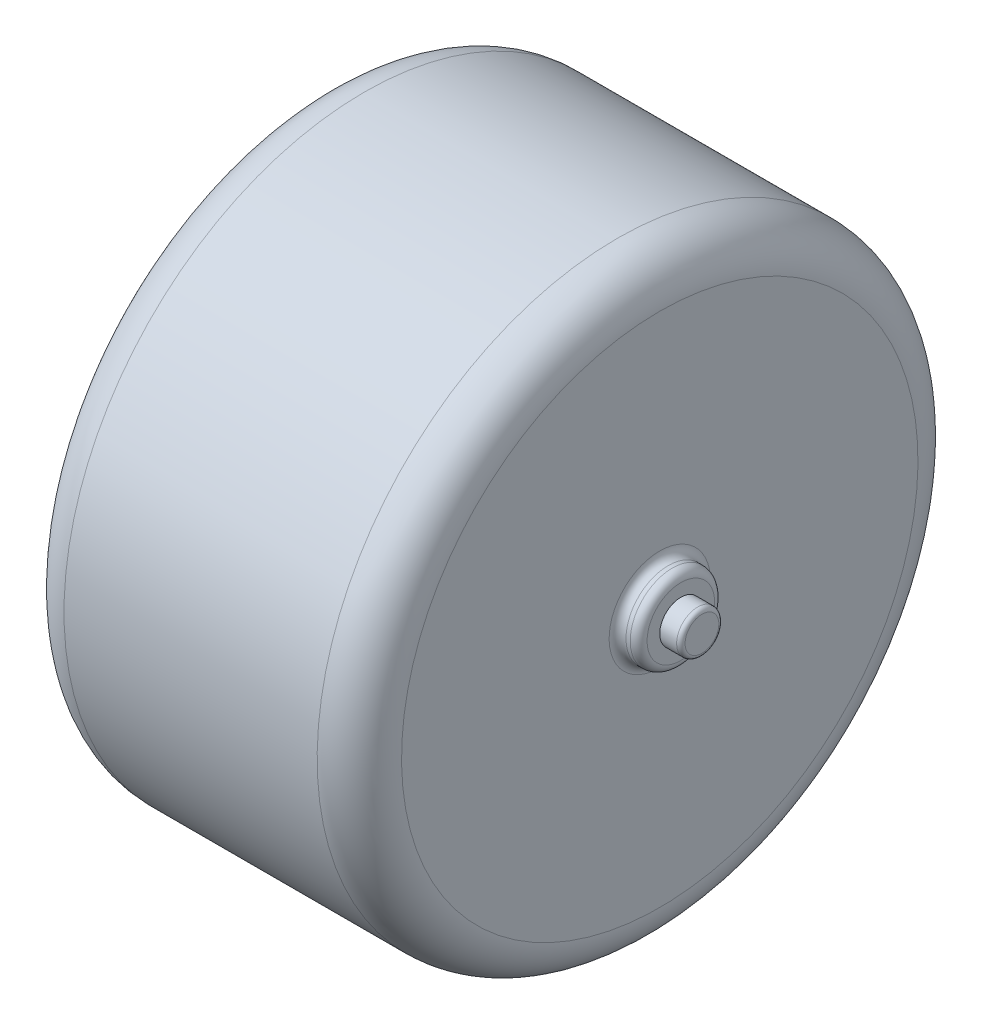
ISO-10303-21;
HEADER;
FILE_DESCRIPTION(('STEP AP214'),'2;1');
FILE_NAME('part.step','',(''),(''),'','','');
FILE_SCHEMA(('AUTOMOTIVE_DESIGN { 1 0 10303 214 1 1 1 1 }'));
ENDSEC;
DATA;
#1=APPLICATION_CONTEXT('core data for automotive mechanical design processes');
#2=APPLICATION_PROTOCOL_DEFINITION('international standard','automotive_design',2000,#1);
#3=PRODUCT_CONTEXT('',#1,'mechanical');
#4=PRODUCT('Part','Part','',(#3));
#5=PRODUCT_RELATED_PRODUCT_CATEGORY('part','',(#4));
#6=PRODUCT_DEFINITION_FORMATION('','',#4);
#7=PRODUCT_DEFINITION_CONTEXT('part definition',#1,'design');
#8=PRODUCT_DEFINITION('design','',#6,#7);
#9=PRODUCT_DEFINITION_SHAPE('','',#8);
#10=(LENGTH_UNIT() NAMED_UNIT(*) SI_UNIT(.MILLI.,.METRE.));
#11=(NAMED_UNIT(*) PLANE_ANGLE_UNIT() SI_UNIT($,.RADIAN.));
#12=(NAMED_UNIT(*) SI_UNIT($,.STERADIAN.) SOLID_ANGLE_UNIT());
#13=UNCERTAINTY_MEASURE_WITH_UNIT(LENGTH_MEASURE(1.E-05),#10,'distance_accuracy_value','');
#14=(GEOMETRIC_REPRESENTATION_CONTEXT(3) GLOBAL_UNCERTAINTY_ASSIGNED_CONTEXT((#13)) GLOBAL_UNIT_ASSIGNED_CONTEXT((#10,
#11,#12)) REPRESENTATION_CONTEXT('',''));
#15=CARTESIAN_POINT('',(0.,0.,0.));
#16=DIRECTION('',(0.,0.,1.));
#17=DIRECTION('',(1.,0.,0.));
#18=AXIS2_PLACEMENT_3D('',#15,#16,#17);
#19=CARTESIAN_POINT('',(0.,0.,0.));
#20=DIRECTION('',(-1.,0.,0.));
#21=DIRECTION('',(0.,-1.,0.));
#22=AXIS2_PLACEMENT_3D('',#19,#20,#21);
#23=PLANE('',#22);
#24=CARTESIAN_POINT('',(0.,0.,0.));
#25=DIRECTION('',(-1.,0.,0.));
#26=DIRECTION('',(0.,-1.,0.));
#27=AXIS2_PLACEMENT_3D('',#24,#25,#26);
#28=CIRCLE('',#27,5.08);
#29=CARTESIAN_POINT('',(0.,-5.08,0.));
#30=VERTEX_POINT('',#29);
#31=EDGE_CURVE('E11',#30,#30,#28,.T.);
#32=ORIENTED_EDGE('',*,*,#31,.T.);
#33=EDGE_LOOP('',(#32));
#34=FACE_BOUND('',#33,.T.);
#35=ADVANCED_FACE('F38',(#34),#23,.T.);
#36=CARTESIAN_POINT('',(146.05,0.,0.));
#37=DIRECTION('',(1.,0.,0.));
#38=DIRECTION('',(0.,1.,0.));
#39=AXIS2_PLACEMENT_3D('',#36,#37,#38);
#40=CYLINDRICAL_SURFACE('',#39,6.35);
#41=CARTESIAN_POINT('',(1.26999999999999,0.,0.));
#42=DIRECTION('',(-1.,0.,0.));
#43=DIRECTION('',(0.,-1.,0.));
#44=AXIS2_PLACEMENT_3D('',#41,#42,#43);
#45=CIRCLE('',#44,6.35);
#46=CARTESIAN_POINT('',(1.26999999999999,-6.35,0.));
#47=VERTEX_POINT('',#46);
#48=EDGE_CURVE('E46',#47,#47,#45,.F.);
#49=ORIENTED_EDGE('',*,*,#48,.T.);
#50=EDGE_LOOP('',(#49));
#51=FACE_BOUND('',#50,.T.);
#52=CARTESIAN_POINT('',(25.4,0.,0.));
#53=DIRECTION('',(1.,0.,0.));
#54=DIRECTION('',(0.,1.,0.));
#55=AXIS2_PLACEMENT_3D('',#52,#53,#54);
#56=CIRCLE('',#55,6.35);
#57=CARTESIAN_POINT('',(25.4,6.35,0.));
#58=VERTEX_POINT('',#57);
#59=EDGE_CURVE('E100',#58,#58,#56,.T.);
#60=ORIENTED_EDGE('',*,*,#59,.F.);
#61=EDGE_LOOP('',(#60));
#62=FACE_BOUND('',#61,.T.);
#63=ADVANCED_FACE('F147',(#51,#62),#40,.T.);
#64=CARTESIAN_POINT('',(25.4,6.35,0.));
#65=DIRECTION('',(-1.,0.,0.));
#66=DIRECTION('',(0.,-1.,0.));
#67=AXIS2_PLACEMENT_3D('',#64,#65,#66);
#68=PLANE('',#67);
#69=CARTESIAN_POINT('',(25.4,0.,0.));
#70=DIRECTION('',(-1.,0.,0.));
#71=DIRECTION('',(0.,-1.,0.));
#72=AXIS2_PLACEMENT_3D('',#69,#70,#71);
#73=CIRCLE('',#72,10.16);
#74=CARTESIAN_POINT('',(25.4,-10.16,0.));
#75=VERTEX_POINT('',#74);
#76=EDGE_CURVE('E121',#75,#75,#73,.T.);
#77=ORIENTED_EDGE('',*,*,#76,.T.);
#78=EDGE_LOOP('',(#77));
#79=FACE_BOUND('',#78,.T.);
#80=ORIENTED_EDGE('',*,*,#59,.T.);
#81=EDGE_LOOP('',(#80));
#82=FACE_BOUND('',#81,.T.);
#83=ADVANCED_FACE('F169',(#79,#82),#68,.T.);
#84=CARTESIAN_POINT('',(146.05,0.,0.));
#85=DIRECTION('',(1.,0.,0.));
#86=DIRECTION('',(0.,1.,0.));
#87=AXIS2_PLACEMENT_3D('',#84,#85,#86);
#88=CYLINDRICAL_SURFACE('',#87,12.7);
#89=CARTESIAN_POINT('',(27.94,0.,0.));
#90=DIRECTION('',(-1.,0.,0.));
#91=DIRECTION('',(0.,-1.,0.));
#92=AXIS2_PLACEMENT_3D('',#89,#90,#91);
#93=CIRCLE('',#92,12.7);
#94=CARTESIAN_POINT('',(27.94,-12.7,0.));
#95=VERTEX_POINT('',#94);
#96=EDGE_CURVE('E118',#95,#95,#93,.F.);
#97=ORIENTED_EDGE('',*,*,#96,.T.);
#98=EDGE_LOOP('',(#97));
#99=FACE_BOUND('',#98,.T.);
#100=CARTESIAN_POINT('',(29.21,0.,0.));
#101=DIRECTION('',(-1.,0.,0.));
#102=DIRECTION('',(0.,-1.,0.));
#103=AXIS2_PLACEMENT_3D('',#100,#101,#102);
#104=CIRCLE('',#103,12.7);
#105=CARTESIAN_POINT('',(29.21,-12.7,0.));
#106=VERTEX_POINT('',#105);
#107=EDGE_CURVE('E115',#106,#106,#104,.T.);
#108=ORIENTED_EDGE('',*,*,#107,.T.);
#109=EDGE_LOOP('',(#108));
#110=FACE_BOUND('',#109,.T.);
#111=ADVANCED_FACE('F233',(#99,#110),#88,.T.);
#112=CARTESIAN_POINT('',(31.75,12.7,0.));
#113=DIRECTION('',(-1.,0.,0.));
#114=DIRECTION('',(0.,-1.,0.));
#115=AXIS2_PLACEMENT_3D('',#112,#113,#114);
#116=PLANE('',#115);
#117=CARTESIAN_POINT('',(31.75,-31.7499999999995,-54.9926131403121));
#118=DIRECTION('',(-1.,0.,0.));
#119=DIRECTION('',(0.,0.,1.));
#120=AXIS2_PLACEMENT_3D('',#117,#118,#119);
#121=CIRCLE('',#120,4.7625);
#122=CARTESIAN_POINT('',(31.75,-31.7499999999995,-50.2301131403121));
#123=VERTEX_POINT('',#122);
#124=EDGE_CURVE('E449',#123,#123,#121,.T.);
#125=ORIENTED_EDGE('',*,*,#124,.F.);
#126=EDGE_LOOP('',(#125));
#127=FACE_BOUND('',#126,.T.);
#128=CARTESIAN_POINT('',(31.75,-31.7500000000003,54.9926131403117));
#129=DIRECTION('',(-1.,0.,0.));
#130=DIRECTION('',(0.,0.,1.));
#131=AXIS2_PLACEMENT_3D('',#128,#129,#130);
#132=CIRCLE('',#131,4.7625);
#133=CARTESIAN_POINT('',(31.75,-31.7500000000003,59.7551131403117));
#134=VERTEX_POINT('',#133);
#135=EDGE_CURVE('E66',#134,#134,#132,.T.);
#136=ORIENTED_EDGE('',*,*,#135,.F.);
#137=EDGE_LOOP('',(#136));
#138=FACE_BOUND('',#137,.T.);
#139=CARTESIAN_POINT('',(31.75,63.5,0.));
#140=DIRECTION('',(-1.,0.,0.));
#141=DIRECTION('',(0.,0.,1.));
#142=AXIS2_PLACEMENT_3D('',#139,#140,#141);
#143=CIRCLE('',#142,4.7625);
#144=CARTESIAN_POINT('',(31.75,63.5,4.7625));
#145=VERTEX_POINT('',#144);
#146=EDGE_CURVE('E85',#145,#145,#143,.T.);
#147=ORIENTED_EDGE('',*,*,#146,.F.);
#148=EDGE_LOOP('',(#147));
#149=FACE_BOUND('',#148,.T.);
#150=CARTESIAN_POINT('',(31.75,0.,0.));
#151=DIRECTION('',(-1.,0.,0.));
#152=DIRECTION('',(0.,-1.,0.));
#153=AXIS2_PLACEMENT_3D('',#150,#151,#152);
#154=CIRCLE('',#153,15.24);
#155=CARTESIAN_POINT('',(31.75,-15.24,0.));
#156=VERTEX_POINT('',#155);
#157=EDGE_CURVE('E124',#156,#156,#154,.F.);
#158=ORIENTED_EDGE('',*,*,#157,.T.);
#159=EDGE_LOOP('',(#158));
#160=FACE_BOUND('',#159,.T.);
#161=CARTESIAN_POINT('',(31.75,0.,0.));
#162=DIRECTION('',(-1.,0.,0.));
#163=DIRECTION('',(0.,-1.,0.));
#164=AXIS2_PLACEMENT_3D('',#161,#162,#163);
#165=CIRCLE('',#164,77.7300961765321);
#166=CARTESIAN_POINT('',(31.75,-77.7300961765321,0.));
#167=VERTEX_POINT('',#166);
#168=EDGE_CURVE('E112',#167,#167,#165,.T.);
#169=ORIENTED_EDGE('',*,*,#168,.T.);
#170=EDGE_LOOP('',(#169));
#171=FACE_BOUND('',#170,.T.);
#172=ADVANCED_FACE('F229',(#127,#138,#149,#160,#171),#116,.T.);
#173=CARTESIAN_POINT('',(146.05,0.,0.));
#174=DIRECTION('',(1.,0.,0.));
#175=DIRECTION('',(0.,1.,0.));
#176=AXIS2_PLACEMENT_3D('',#173,#174,#175);
#177=CYLINDRICAL_SURFACE('',#176,90.4300961765321);
#178=CARTESIAN_POINT('',(120.65,0.,0.));
#179=DIRECTION('',(1.,0.,0.));
#180=DIRECTION('',(0.,1.,0.));
#181=AXIS2_PLACEMENT_3D('',#178,#179,#180);
#182=CIRCLE('',#181,90.4300961765321);
#183=CARTESIAN_POINT('',(120.65,90.4300961765321,0.));
#184=VERTEX_POINT('',#183);
#185=EDGE_CURVE('E109',#184,#184,#182,.F.);
#186=ORIENTED_EDGE('',*,*,#185,.T.);
#187=EDGE_LOOP('',(#186));
#188=FACE_BOUND('',#187,.T.);
#189=CARTESIAN_POINT('',(44.45,0.,0.));
#190=DIRECTION('',(-1.,0.,0.));
#191=DIRECTION('',(0.,-1.,0.));
#192=AXIS2_PLACEMENT_3D('',#189,#190,#191);
#193=CIRCLE('',#192,90.4300961765321);
#194=CARTESIAN_POINT('',(44.45,-90.4300961765321,0.));
#195=VERTEX_POINT('',#194);
#196=EDGE_CURVE('E106',#195,#195,#193,.F.);
#197=ORIENTED_EDGE('',*,*,#196,.T.);
#198=EDGE_LOOP('',(#197));
#199=FACE_BOUND('',#198,.T.);
#200=ADVANCED_FACE('F225',(#188,#199),#177,.T.);
#201=CARTESIAN_POINT('',(133.35,90.4300961765321,0.));
#202=DIRECTION('',(1.,0.,0.));
#203=DIRECTION('',(0.,1.,0.));
#204=AXIS2_PLACEMENT_3D('',#201,#202,#203);
#205=PLANE('',#204);
#206=CARTESIAN_POINT('',(133.35,0.,0.));
#207=DIRECTION('',(1.,0.,0.));
#208=DIRECTION('',(0.,1.,0.));
#209=AXIS2_PLACEMENT_3D('',#206,#207,#208);
#210=CIRCLE('',#209,15.24);
#211=CARTESIAN_POINT('',(133.35,15.24,0.));
#212=VERTEX_POINT('',#211);
#213=EDGE_CURVE('E133',#212,#212,#210,.F.);
#214=ORIENTED_EDGE('',*,*,#213,.T.);
#215=EDGE_LOOP('',(#214));
#216=FACE_BOUND('',#215,.T.);
#217=CARTESIAN_POINT('',(133.35,0.,0.));
#218=DIRECTION('',(1.,0.,0.));
#219=DIRECTION('',(0.,1.,0.));
#220=AXIS2_PLACEMENT_3D('',#217,#218,#219);
#221=CIRCLE('',#220,77.7300961765321);
#222=CARTESIAN_POINT('',(133.35,77.7300961765321,0.));
#223=VERTEX_POINT('',#222);
#224=EDGE_CURVE('E103',#223,#223,#221,.T.);
#225=ORIENTED_EDGE('',*,*,#224,.T.);
#226=EDGE_LOOP('',(#225));
#227=FACE_BOUND('',#226,.T.);
#228=ADVANCED_FACE('F221',(#216,#227),#205,.T.);
#229=CARTESIAN_POINT('',(146.05,0.,0.));
#230=DIRECTION('',(1.,0.,0.));
#231=DIRECTION('',(0.,1.,0.));
#232=AXIS2_PLACEMENT_3D('',#229,#230,#231);
#233=CYLINDRICAL_SURFACE('',#232,12.7);
#234=CARTESIAN_POINT('',(135.89,0.,0.));
#235=DIRECTION('',(1.,0.,0.));
#236=DIRECTION('',(0.,1.,0.));
#237=AXIS2_PLACEMENT_3D('',#234,#235,#236);
#238=CIRCLE('',#237,12.7);
#239=CARTESIAN_POINT('',(135.89,12.7,0.));
#240=VERTEX_POINT('',#239);
#241=EDGE_CURVE('E130',#240,#240,#238,.T.);
#242=ORIENTED_EDGE('',*,*,#241,.T.);
#243=EDGE_LOOP('',(#242));
#244=FACE_BOUND('',#243,.T.);
#245=CARTESIAN_POINT('',(137.16,0.,0.));
#246=DIRECTION('',(1.,0.,0.));
#247=DIRECTION('',(0.,1.,0.));
#248=AXIS2_PLACEMENT_3D('',#245,#246,#247);
#249=CIRCLE('',#248,12.7);
#250=CARTESIAN_POINT('',(137.16,12.7,0.));
#251=VERTEX_POINT('',#250);
#252=EDGE_CURVE('E127',#251,#251,#249,.F.);
#253=ORIENTED_EDGE('',*,*,#252,.T.);
#254=EDGE_LOOP('',(#253));
#255=FACE_BOUND('',#254,.T.);
#256=ADVANCED_FACE('F206',(#244,#255),#233,.T.);
#257=CARTESIAN_POINT('',(139.7,12.7,0.));
#258=DIRECTION('',(1.,0.,0.));
#259=DIRECTION('',(0.,1.,0.));
#260=AXIS2_PLACEMENT_3D('',#257,#258,#259);
#261=PLANE('',#260);
#262=CARTESIAN_POINT('',(139.7,0.,0.));
#263=DIRECTION('',(1.,0.,0.));
#264=DIRECTION('',(0.,1.,0.));
#265=AXIS2_PLACEMENT_3D('',#262,#263,#264);
#266=CIRCLE('',#265,10.16);
#267=CARTESIAN_POINT('',(139.7,10.16,0.));
#268=VERTEX_POINT('',#267);
#269=EDGE_CURVE('E136',#268,#268,#266,.T.);
#270=ORIENTED_EDGE('',*,*,#269,.T.);
#271=EDGE_LOOP('',(#270));
#272=FACE_BOUND('',#271,.T.);
#273=CARTESIAN_POINT('',(139.7,0.,0.));
#274=DIRECTION('',(1.,0.,0.));
#275=DIRECTION('',(0.,1.,0.));
#276=AXIS2_PLACEMENT_3D('',#273,#274,#275);
#277=CIRCLE('',#276,6.35);
#278=CARTESIAN_POINT('',(139.7,6.35,0.));
#279=VERTEX_POINT('',#278);
#280=EDGE_CURVE('E97',#279,#279,#277,.T.);
#281=ORIENTED_EDGE('',*,*,#280,.F.);
#282=EDGE_LOOP('',(#281));
#283=FACE_BOUND('',#282,.T.);
#284=ADVANCED_FACE('F202',(#272,#283),#261,.T.);
#285=CARTESIAN_POINT('',(146.05,0.,0.));
#286=DIRECTION('',(1.,0.,0.));
#287=DIRECTION('',(0.,1.,0.));
#288=AXIS2_PLACEMENT_3D('',#285,#286,#287);
#289=CYLINDRICAL_SURFACE('',#288,6.35);
#290=CARTESIAN_POINT('',(144.78,0.,0.));
#291=DIRECTION('',(1.,0.,0.));
#292=DIRECTION('',(0.,1.,0.));
#293=AXIS2_PLACEMENT_3D('',#290,#291,#292);
#294=CIRCLE('',#293,6.35);
#295=CARTESIAN_POINT('',(144.78,6.35,0.));
#296=VERTEX_POINT('',#295);
#297=EDGE_CURVE('E142',#296,#296,#294,.F.);
#298=ORIENTED_EDGE('',*,*,#297,.T.);
#299=EDGE_LOOP('',(#298));
#300=FACE_BOUND('',#299,.T.);
#301=ORIENTED_EDGE('',*,*,#280,.T.);
#302=EDGE_LOOP('',(#301));
#303=FACE_BOUND('',#302,.T.);
#304=ADVANCED_FACE('F205',(#300,#303),#289,.T.);
#305=CARTESIAN_POINT('',(146.05,6.35,0.));
#306=DIRECTION('',(1.,0.,0.));
#307=DIRECTION('',(0.,1.,0.));
#308=AXIS2_PLACEMENT_3D('',#305,#306,#307);
#309=PLANE('',#308);
#310=CARTESIAN_POINT('',(146.05,0.,0.));
#311=DIRECTION('',(1.,0.,0.));
#312=DIRECTION('',(0.,1.,0.));
#313=AXIS2_PLACEMENT_3D('',#310,#311,#312);
#314=CIRCLE('',#313,5.08);
#315=CARTESIAN_POINT('',(146.05,5.08,0.));
#316=VERTEX_POINT('',#315);
#317=EDGE_CURVE('E139',#316,#316,#314,.T.);
#318=ORIENTED_EDGE('',*,*,#317,.T.);
#319=EDGE_LOOP('',(#318));
#320=FACE_BOUND('',#319,.T.);
#321=ADVANCED_FACE('F177',(#320),#309,.T.);
#322=CARTESIAN_POINT('',(120.65,0.,0.));
#323=DIRECTION('',(1.,0.,0.));
#324=DIRECTION('',(0.,1.,0.));
#325=AXIS2_PLACEMENT_3D('',#322,#323,#324);
#326=TOROIDAL_SURFACE('',#325,77.7300961765321,12.7);
#327=ORIENTED_EDGE('',*,*,#185,.F.);
#328=EDGE_LOOP('',(#327));
#329=FACE_BOUND('',#328,.T.);
#330=ORIENTED_EDGE('',*,*,#224,.F.);
#331=EDGE_LOOP('',(#330));
#332=FACE_BOUND('',#331,.T.);
#333=ADVANCED_FACE('F173',(#329,#332),#326,.T.);
#334=CARTESIAN_POINT('',(44.45,0.,0.));
#335=DIRECTION('',(-1.,0.,0.));
#336=DIRECTION('',(0.,-1.,0.));
#337=AXIS2_PLACEMENT_3D('',#334,#335,#336);
#338=TOROIDAL_SURFACE('',#337,77.7300961765321,12.7);
#339=ORIENTED_EDGE('',*,*,#168,.F.);
#340=EDGE_LOOP('',(#339));
#341=FACE_BOUND('',#340,.T.);
#342=ORIENTED_EDGE('',*,*,#196,.F.);
#343=EDGE_LOOP('',(#342));
#344=FACE_BOUND('',#343,.T.);
#345=ADVANCED_FACE('F176',(#341,#344),#338,.T.);
#346=CARTESIAN_POINT('',(27.94,0.,0.));
#347=DIRECTION('',(-1.,0.,0.));
#348=DIRECTION('',(0.,-1.,0.));
#349=AXIS2_PLACEMENT_3D('',#346,#347,#348);
#350=TOROIDAL_SURFACE('',#349,10.16,2.54);
#351=ORIENTED_EDGE('',*,*,#76,.F.);
#352=EDGE_LOOP('',(#351));
#353=FACE_BOUND('',#352,.T.);
#354=ORIENTED_EDGE('',*,*,#96,.F.);
#355=EDGE_LOOP('',(#354));
#356=FACE_BOUND('',#355,.T.);
#357=ADVANCED_FACE('F181',(#353,#356),#350,.T.);
#358=CARTESIAN_POINT('',(29.21,0.,0.));
#359=DIRECTION('',(-1.,0.,0.));
#360=DIRECTION('',(0.,-1.,0.));
#361=AXIS2_PLACEMENT_3D('',#358,#359,#360);
#362=TOROIDAL_SURFACE('',#361,15.24,2.54);
#363=ORIENTED_EDGE('',*,*,#107,.F.);
#364=EDGE_LOOP('',(#363));
#365=FACE_BOUND('',#364,.T.);
#366=ORIENTED_EDGE('',*,*,#157,.F.);
#367=EDGE_LOOP('',(#366));
#368=FACE_BOUND('',#367,.T.);
#369=ADVANCED_FACE('F185',(#365,#368),#362,.F.);
#370=CARTESIAN_POINT('',(135.89,0.,0.));
#371=DIRECTION('',(1.,0.,0.));
#372=DIRECTION('',(0.,1.,0.));
#373=AXIS2_PLACEMENT_3D('',#370,#371,#372);
#374=TOROIDAL_SURFACE('',#373,15.24,2.54);
#375=ORIENTED_EDGE('',*,*,#213,.F.);
#376=EDGE_LOOP('',(#375));
#377=FACE_BOUND('',#376,.T.);
#378=ORIENTED_EDGE('',*,*,#241,.F.);
#379=EDGE_LOOP('',(#378));
#380=FACE_BOUND('',#379,.T.);
#381=ADVANCED_FACE('F189',(#377,#380),#374,.F.);
#382=CARTESIAN_POINT('',(137.16,0.,0.));
#383=DIRECTION('',(1.,0.,0.));
#384=DIRECTION('',(0.,1.,0.));
#385=AXIS2_PLACEMENT_3D('',#382,#383,#384);
#386=TOROIDAL_SURFACE('',#385,10.16,2.54);
#387=ORIENTED_EDGE('',*,*,#252,.F.);
#388=EDGE_LOOP('',(#387));
#389=FACE_BOUND('',#388,.T.);
#390=ORIENTED_EDGE('',*,*,#269,.F.);
#391=EDGE_LOOP('',(#390));
#392=FACE_BOUND('',#391,.T.);
#393=ADVANCED_FACE('F160',(#389,#392),#386,.T.);
#394=CARTESIAN_POINT('',(144.78,0.,0.));
#395=DIRECTION('',(1.,0.,0.));
#396=DIRECTION('',(0.,1.,0.));
#397=AXIS2_PLACEMENT_3D('',#394,#395,#396);
#398=TOROIDAL_SURFACE('',#397,5.08,1.27);
#399=ORIENTED_EDGE('',*,*,#297,.F.);
#400=EDGE_LOOP('',(#399));
#401=FACE_BOUND('',#400,.T.);
#402=ORIENTED_EDGE('',*,*,#317,.F.);
#403=EDGE_LOOP('',(#402));
#404=FACE_BOUND('',#403,.T.);
#405=ADVANCED_FACE('F152',(#401,#404),#398,.T.);
#406=CARTESIAN_POINT('',(1.26999999999999,0.,0.));
#407=DIRECTION('',(-1.,0.,0.));
#408=DIRECTION('',(0.,-1.,0.));
#409=AXIS2_PLACEMENT_3D('',#406,#407,#408);
#410=TOROIDAL_SURFACE('',#409,5.08,1.27);
#411=ORIENTED_EDGE('',*,*,#31,.F.);
#412=EDGE_LOOP('',(#411));
#413=FACE_BOUND('',#412,.T.);
#414=ORIENTED_EDGE('',*,*,#48,.F.);
#415=EDGE_LOOP('',(#414));
#416=FACE_BOUND('',#415,.T.);
#417=ADVANCED_FACE('F40',(#413,#416),#410,.T.);
#418=CARTESIAN_POINT('',(58.7375,63.5,0.));
#419=DIRECTION('',(-1.,0.,0.));
#420=DIRECTION('',(0.,0.,1.));
#421=AXIS2_PLACEMENT_3D('',#418,#419,#420);
#422=CONICAL_SURFACE('',#421,3.96874999999999,1.02974425867665);
#423=CARTESIAN_POINT('',(61.1221655817656,63.5,0.));
#424=VERTEX_POINT('',#423);
#425=VERTEX_LOOP('',#424);
#426=FACE_BOUND('',#425,.T.);
#427=CARTESIAN_POINT('',(58.7375,63.5,0.));
#428=DIRECTION('',(-1.,0.,0.));
#429=DIRECTION('',(0.,0.,1.));
#430=AXIS2_PLACEMENT_3D('',#427,#428,#429);
#431=CIRCLE('',#430,3.96874999999999);
#432=CARTESIAN_POINT('',(58.7375,63.5,3.96874999999999));
#433=VERTEX_POINT('',#432);
#434=EDGE_CURVE('E94',#433,#433,#431,.T.);
#435=ORIENTED_EDGE('',*,*,#434,.T.);
#436=EDGE_LOOP('',(#435));
#437=FACE_BOUND('',#436,.T.);
#438=ADVANCED_FACE('F151',(#426,#437),#422,.F.);
#439=CARTESIAN_POINT('',(31.75,63.5,0.));
#440=DIRECTION('',(-1.,0.,0.));
#441=DIRECTION('',(0.,0.,1.));
#442=AXIS2_PLACEMENT_3D('',#439,#440,#441);
#443=CYLINDRICAL_SURFACE('',#442,3.96874999999999);
#444=ORIENTED_EDGE('',*,*,#434,.F.);
#445=EDGE_LOOP('',(#444));
#446=FACE_BOUND('',#445,.T.);
#447=CARTESIAN_POINT('',(50.8,63.5,0.));
#448=DIRECTION('',(-1.,0.,0.));
#449=DIRECTION('',(0.,0.,1.));
#450=AXIS2_PLACEMENT_3D('',#447,#448,#449);
#451=CIRCLE('',#450,3.96874999999999);
#452=CARTESIAN_POINT('',(50.8,63.5,3.96874999999999));
#453=VERTEX_POINT('',#452);
#454=EDGE_CURVE('E91',#453,#453,#451,.T.);
#455=ORIENTED_EDGE('',*,*,#454,.T.);
#456=EDGE_LOOP('',(#455));
#457=FACE_BOUND('',#456,.T.);
#458=ADVANCED_FACE('F158',(#446,#457),#443,.F.);
#459=CARTESIAN_POINT('',(50.8,67.46875,0.));
#460=DIRECTION('',(1.,0.,0.));
#461=DIRECTION('',(0.,0.,-1.));
#462=AXIS2_PLACEMENT_3D('',#459,#460,#461);
#463=PLANE('',#462);
#464=ORIENTED_EDGE('',*,*,#454,.F.);
#465=EDGE_LOOP('',(#464));
#466=FACE_BOUND('',#465,.T.);
#467=CARTESIAN_POINT('',(50.8,63.5,0.));
#468=DIRECTION('',(-1.,0.,0.));
#469=DIRECTION('',(0.,0.,1.));
#470=AXIS2_PLACEMENT_3D('',#467,#468,#469);
#471=CIRCLE('',#470,4.76249999999999);
#472=CARTESIAN_POINT('',(50.8,63.5,4.76249999999999));
#473=VERTEX_POINT('',#472);
#474=EDGE_CURVE('E88',#473,#473,#471,.T.);
#475=ORIENTED_EDGE('',*,*,#474,.T.);
#476=EDGE_LOOP('',(#475));
#477=FACE_BOUND('',#476,.T.);
#478=ADVANCED_FACE('F342',(#466,#477),#463,.F.);
#479=CARTESIAN_POINT('',(31.75,63.5,0.));
#480=DIRECTION('',(-1.,0.,0.));
#481=DIRECTION('',(0.,0.,1.));
#482=AXIS2_PLACEMENT_3D('',#479,#480,#481);
#483=CYLINDRICAL_SURFACE('',#482,4.7625);
#484=ORIENTED_EDGE('',*,*,#474,.F.);
#485=EDGE_LOOP('',(#484));
#486=FACE_BOUND('',#485,.T.);
#487=ORIENTED_EDGE('',*,*,#146,.T.);
#488=EDGE_LOOP('',(#487));
#489=FACE_BOUND('',#488,.T.);
#490=ADVANCED_FACE('F352',(#486,#489),#483,.F.);
#491=CARTESIAN_POINT('',(58.7375,-31.7500000000003,54.9926131403117));
#492=DIRECTION('',(-1.,0.,0.));
#493=DIRECTION('',(0.,0.,1.));
#494=AXIS2_PLACEMENT_3D('',#491,#492,#493);
#495=CONICAL_SURFACE('',#494,3.96874999999999,1.02974425867665);
#496=CARTESIAN_POINT('',(61.1221655817656,-31.7500000000003,54.9926131403117));
#497=VERTEX_POINT('',#496);
#498=VERTEX_LOOP('',#497);
#499=FACE_BOUND('',#498,.T.);
#500=CARTESIAN_POINT('',(58.7375,-31.7500000000003,54.9926131403117));
#501=DIRECTION('',(-1.,0.,0.));
#502=DIRECTION('',(0.,0.,1.));
#503=AXIS2_PLACEMENT_3D('',#500,#501,#502);
#504=CIRCLE('',#503,3.96874999999999);
#505=CARTESIAN_POINT('',(58.7375,-31.7500000000003,58.9613631403117));
#506=VERTEX_POINT('',#505);
#507=EDGE_CURVE('E82',#506,#506,#504,.T.);
#508=ORIENTED_EDGE('',*,*,#507,.T.);
#509=EDGE_LOOP('',(#508));
#510=FACE_BOUND('',#509,.T.);
#511=ADVANCED_FACE('F361',(#499,#510),#495,.F.);
#512=CARTESIAN_POINT('',(31.75,-31.7500000000003,54.9926131403117));
#513=DIRECTION('',(-1.,0.,0.));
#514=DIRECTION('',(0.,0.,1.));
#515=AXIS2_PLACEMENT_3D('',#512,#513,#514);
#516=CYLINDRICAL_SURFACE('',#515,3.96874999999999);
#517=ORIENTED_EDGE('',*,*,#507,.F.);
#518=EDGE_LOOP('',(#517));
#519=FACE_BOUND('',#518,.T.);
#520=CARTESIAN_POINT('',(50.8,-31.7500000000003,54.9926131403117));
#521=DIRECTION('',(-1.,0.,0.));
#522=DIRECTION('',(0.,0.,1.));
#523=AXIS2_PLACEMENT_3D('',#520,#521,#522);
#524=CIRCLE('',#523,3.96874999999999);
#525=CARTESIAN_POINT('',(50.8,-31.7500000000003,58.9613631403117));
#526=VERTEX_POINT('',#525);
#527=EDGE_CURVE('E79',#526,#526,#524,.T.);
#528=ORIENTED_EDGE('',*,*,#527,.T.);
#529=EDGE_LOOP('',(#528));
#530=FACE_BOUND('',#529,.T.);
#531=ADVANCED_FACE('F378',(#519,#530),#516,.F.);
#532=CARTESIAN_POINT('',(50.8,-27.7812500000003,54.9926131403117));
#533=DIRECTION('',(1.,0.,0.));
#534=DIRECTION('',(0.,0.,-1.));
#535=AXIS2_PLACEMENT_3D('',#532,#533,#534);
#536=PLANE('',#535);
#537=ORIENTED_EDGE('',*,*,#527,.F.);
#538=EDGE_LOOP('',(#537));
#539=FACE_BOUND('',#538,.T.);
#540=CARTESIAN_POINT('',(50.8,-31.7500000000003,54.9926131403117));
#541=DIRECTION('',(-1.,0.,0.));
#542=DIRECTION('',(0.,0.,1.));
#543=AXIS2_PLACEMENT_3D('',#540,#541,#542);
#544=CIRCLE('',#543,4.7625);
#545=CARTESIAN_POINT('',(50.8,-31.7500000000003,59.7551131403117));
#546=VERTEX_POINT('',#545);
#547=EDGE_CURVE('E70',#546,#546,#544,.T.);
#548=ORIENTED_EDGE('',*,*,#547,.T.);
#549=EDGE_LOOP('',(#548));
#550=FACE_BOUND('',#549,.T.);
#551=ADVANCED_FACE('F387',(#539,#550),#536,.F.);
#552=CARTESIAN_POINT('',(31.75,-31.7500000000003,54.9926131403117));
#553=DIRECTION('',(-1.,0.,0.));
#554=DIRECTION('',(0.,0.,1.));
#555=AXIS2_PLACEMENT_3D('',#552,#553,#554);
#556=CYLINDRICAL_SURFACE('',#555,4.7625);
#557=ORIENTED_EDGE('',*,*,#547,.F.);
#558=EDGE_LOOP('',(#557));
#559=FACE_BOUND('',#558,.T.);
#560=ORIENTED_EDGE('',*,*,#135,.T.);
#561=EDGE_LOOP('',(#560));
#562=FACE_BOUND('',#561,.T.);
#563=ADVANCED_FACE('F60',(#559,#562),#556,.F.);
#564=CARTESIAN_POINT('',(58.7375,-31.7499999999995,-54.9926131403121));
#565=DIRECTION('',(-1.,0.,0.));
#566=DIRECTION('',(0.,0.,1.));
#567=AXIS2_PLACEMENT_3D('',#564,#565,#566);
#568=CONICAL_SURFACE('',#567,3.96874999999999,1.02974425867665);
#569=CARTESIAN_POINT('',(61.1221655817656,-31.7499999999995,-54.9926131403121));
#570=VERTEX_POINT('',#569);
#571=VERTEX_LOOP('',#570);
#572=FACE_BOUND('',#571,.T.);
#573=CARTESIAN_POINT('',(58.7375,-31.7499999999995,-54.9926131403121));
#574=DIRECTION('',(-1.,0.,0.));
#575=DIRECTION('',(0.,0.,1.));
#576=AXIS2_PLACEMENT_3D('',#573,#574,#575);
#577=CIRCLE('',#576,3.96874999999999);
#578=CARTESIAN_POINT('',(58.7375,-31.7499999999995,-51.0238631403122));
#579=VERTEX_POINT('',#578);
#580=EDGE_CURVE('E64',#579,#579,#577,.T.);
#581=ORIENTED_EDGE('',*,*,#580,.T.);
#582=EDGE_LOOP('',(#581));
#583=FACE_BOUND('',#582,.T.);
#584=ADVANCED_FACE('F56',(#572,#583),#568,.F.);
#585=CARTESIAN_POINT('',(31.75,-31.7499999999995,-54.9926131403121));
#586=DIRECTION('',(-1.,0.,0.));
#587=DIRECTION('',(0.,0.,1.));
#588=AXIS2_PLACEMENT_3D('',#585,#586,#587);
#589=CYLINDRICAL_SURFACE('',#588,3.96874999999999);
#590=ORIENTED_EDGE('',*,*,#580,.F.);
#591=EDGE_LOOP('',(#590));
#592=FACE_BOUND('',#591,.T.);
#593=CARTESIAN_POINT('',(50.8,-31.7499999999995,-54.9926131403121));
#594=DIRECTION('',(-1.,0.,0.));
#595=DIRECTION('',(0.,0.,1.));
#596=AXIS2_PLACEMENT_3D('',#593,#594,#595);
#597=CIRCLE('',#596,3.96874999999999);
#598=CARTESIAN_POINT('',(50.8,-31.7499999999995,-51.0238631403122));
#599=VERTEX_POINT('',#598);
#600=EDGE_CURVE('E67',#599,#599,#597,.T.);
#601=ORIENTED_EDGE('',*,*,#600,.T.);
#602=EDGE_LOOP('',(#601));
#603=FACE_BOUND('',#602,.T.);
#604=ADVANCED_FACE('F59',(#592,#603),#589,.F.);
#605=CARTESIAN_POINT('',(50.8,-27.7812499999995,-54.9926131403121));
#606=DIRECTION('',(1.,0.,0.));
#607=DIRECTION('',(0.,0.,-1.));
#608=AXIS2_PLACEMENT_3D('',#605,#606,#607);
#609=PLANE('',#608);
#610=ORIENTED_EDGE('',*,*,#600,.F.);
#611=EDGE_LOOP('',(#610));
#612=FACE_BOUND('',#611,.T.);
#613=CARTESIAN_POINT('',(50.8,-31.7499999999995,-54.9926131403121));
#614=DIRECTION('',(-1.,0.,0.));
#615=DIRECTION('',(0.,0.,1.));
#616=AXIS2_PLACEMENT_3D('',#613,#614,#615);
#617=CIRCLE('',#616,4.7625);
#618=CARTESIAN_POINT('',(50.8,-31.7499999999995,-50.2301131403121));
#619=VERTEX_POINT('',#618);
#620=EDGE_CURVE('E73',#619,#619,#617,.T.);
#621=ORIENTED_EDGE('',*,*,#620,.T.);
#622=EDGE_LOOP('',(#621));
#623=FACE_BOUND('',#622,.T.);
#624=ADVANCED_FACE('F421',(#612,#623),#609,.F.);
#625=CARTESIAN_POINT('',(31.75,-31.7499999999995,-54.9926131403121));
#626=DIRECTION('',(-1.,0.,0.));
#627=DIRECTION('',(0.,0.,1.));
#628=AXIS2_PLACEMENT_3D('',#625,#626,#627);
#629=CYLINDRICAL_SURFACE('',#628,4.7625);
#630=ORIENTED_EDGE('',*,*,#620,.F.);
#631=EDGE_LOOP('',(#630));
#632=FACE_BOUND('',#631,.T.);
#633=ORIENTED_EDGE('',*,*,#124,.T.);
#634=EDGE_LOOP('',(#633));
#635=FACE_BOUND('',#634,.T.);
#636=ADVANCED_FACE('F430',(#632,#635),#629,.F.);
#637=CLOSED_SHELL('',(#35,#63,#83,#111,#172,#200,#228,#256,#284,#304,#321,#333,#345,#357,#369,
#381,#393,#405,#417,#438,#458,#478,#490,#511,#531,#551,#563,#584,#604,#624,#636));
#638=MANIFOLD_SOLID_BREP('B2',#637);
#639=ADVANCED_BREP_SHAPE_REPRESENTATION('',(#18,#638),#14);
#640=SHAPE_DEFINITION_REPRESENTATION(#9,#639);
ENDSEC;
END-ISO-10303-21;
